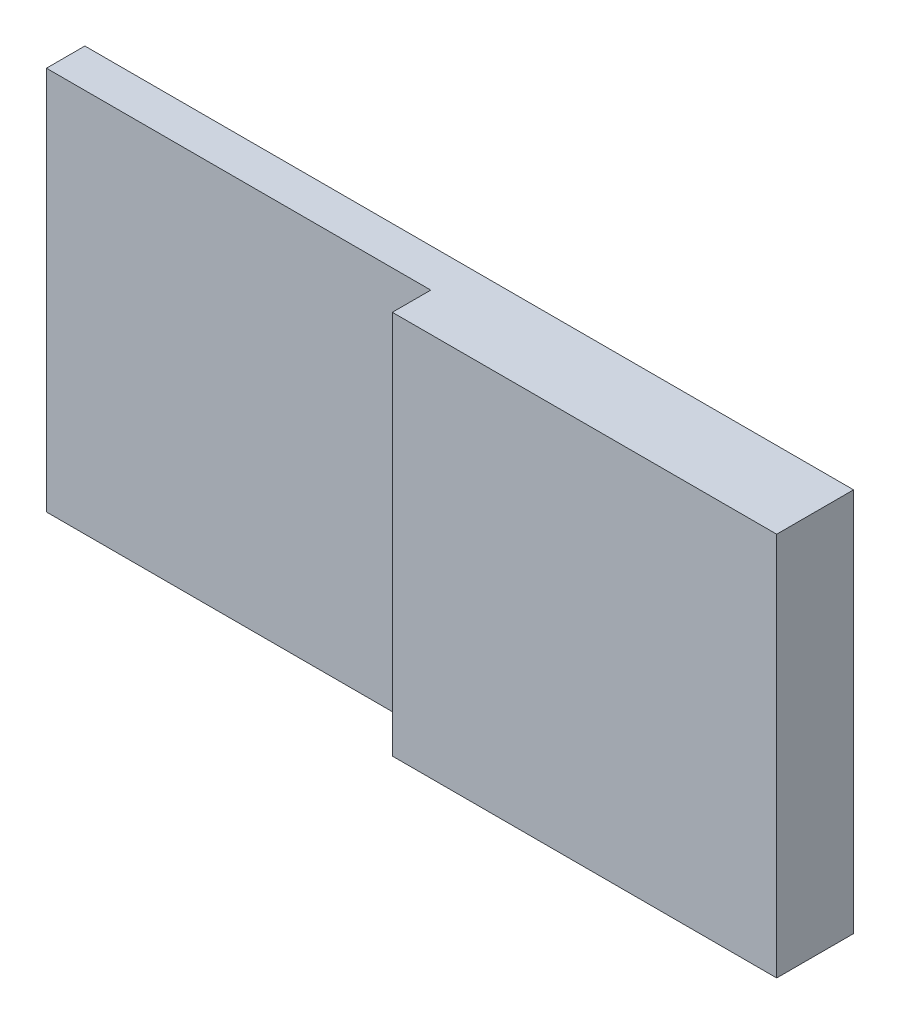
ISO-10303-21;
HEADER;
FILE_DESCRIPTION(('STEP AP214'),'2;1');
FILE_NAME('part.step','',(''),(''),'','','');
FILE_SCHEMA(('AUTOMOTIVE_DESIGN { 1 0 10303 214 1 1 1 1 }'));
ENDSEC;
DATA;
#1=APPLICATION_CONTEXT('core data for automotive mechanical design processes');
#2=APPLICATION_PROTOCOL_DEFINITION('international standard','automotive_design',2000,#1);
#3=PRODUCT_CONTEXT('',#1,'mechanical');
#4=PRODUCT('Part','Part','',(#3));
#5=PRODUCT_RELATED_PRODUCT_CATEGORY('part','',(#4));
#6=PRODUCT_DEFINITION_FORMATION('','',#4);
#7=PRODUCT_DEFINITION_CONTEXT('part definition',#1,'design');
#8=PRODUCT_DEFINITION('design','',#6,#7);
#9=PRODUCT_DEFINITION_SHAPE('','',#8);
#10=(LENGTH_UNIT() NAMED_UNIT(*) SI_UNIT(.MILLI.,.METRE.));
#11=(NAMED_UNIT(*) PLANE_ANGLE_UNIT() SI_UNIT($,.RADIAN.));
#12=(NAMED_UNIT(*) SI_UNIT($,.STERADIAN.) SOLID_ANGLE_UNIT());
#13=UNCERTAINTY_MEASURE_WITH_UNIT(LENGTH_MEASURE(1.E-05),#10,'distance_accuracy_value','');
#14=(GEOMETRIC_REPRESENTATION_CONTEXT(3) GLOBAL_UNCERTAINTY_ASSIGNED_CONTEXT((#13)) GLOBAL_UNIT_ASSIGNED_CONTEXT((#10,
#11,#12)) REPRESENTATION_CONTEXT('',''));
#15=CARTESIAN_POINT('',(0.,0.,0.));
#16=DIRECTION('',(0.,0.,1.));
#17=DIRECTION('',(1.,0.,0.));
#18=AXIS2_PLACEMENT_3D('',#15,#16,#17);
#19=CARTESIAN_POINT('',(0.,0.,10.));
#20=DIRECTION('',(0.,0.,-1.));
#21=DIRECTION('',(-1.,0.,0.));
#22=AXIS2_PLACEMENT_3D('',#19,#20,#21);
#23=PLANE('',#22);
#24=DIRECTION('',(0.,-1.,0.));
#25=VECTOR('',#24,1.);
#26=CARTESIAN_POINT('',(0.,50.,10.));
#27=LINE('',#26,#25);
#28=CARTESIAN_POINT('',(0.,50.,10.));
#29=VERTEX_POINT('',#28);
#30=CARTESIAN_POINT('',(0.,-50.,10.));
#31=VERTEX_POINT('',#30);
#32=EDGE_CURVE('E55',#29,#31,#27,.T.);
#33=ORIENTED_EDGE('',*,*,#32,.F.);
#34=DIRECTION('',(-1.,0.,0.));
#35=VECTOR('',#34,1.);
#36=CARTESIAN_POINT('',(-100.,50.,10.));
#37=LINE('',#36,#35);
#38=CARTESIAN_POINT('',(-100.,50.,10.));
#39=VERTEX_POINT('',#38);
#40=EDGE_CURVE('E94',#29,#39,#37,.T.);
#41=ORIENTED_EDGE('',*,*,#40,.T.);
#42=DIRECTION('',(0.,-1.,0.));
#43=VECTOR('',#42,1.);
#44=CARTESIAN_POINT('',(-100.,-50.,10.));
#45=LINE('',#44,#43);
#46=CARTESIAN_POINT('',(-100.,-50.,10.));
#47=VERTEX_POINT('',#46);
#48=EDGE_CURVE('E61',#39,#47,#45,.T.);
#49=ORIENTED_EDGE('',*,*,#48,.T.);
#50=DIRECTION('',(1.,0.,0.));
#51=VECTOR('',#50,1.);
#52=CARTESIAN_POINT('',(-100.,-50.,10.));
#53=LINE('',#52,#51);
#54=EDGE_CURVE('E105',#47,#31,#53,.T.);
#55=ORIENTED_EDGE('',*,*,#54,.T.);
#56=EDGE_LOOP('',(#33,#41,#49,#55));
#57=FACE_BOUND('',#56,.T.);
#58=ADVANCED_FACE('F39',(#57),#23,.F.);
#59=CARTESIAN_POINT('',(100.,-50.,10.));
#60=DIRECTION('',(-1.,0.,0.));
#61=DIRECTION('',(0.,0.,1.));
#62=AXIS2_PLACEMENT_3D('',#59,#60,#61);
#63=PLANE('',#62);
#64=DIRECTION('',(0.,1.,0.));
#65=VECTOR('',#64,1.);
#66=CARTESIAN_POINT('',(100.,-50.,0.));
#67=LINE('',#66,#65);
#68=CARTESIAN_POINT('',(100.,-50.,0.));
#69=VERTEX_POINT('',#68);
#70=CARTESIAN_POINT('',(100.,50.,0.));
#71=VERTEX_POINT('',#70);
#72=EDGE_CURVE('E101',#69,#71,#67,.T.);
#73=ORIENTED_EDGE('',*,*,#72,.T.);
#74=DIRECTION('',(0.,0.,-1.));
#75=VECTOR('',#74,1.);
#76=CARTESIAN_POINT('',(100.,50.,10.));
#77=LINE('',#76,#75);
#78=CARTESIAN_POINT('',(100.,50.,20.));
#79=VERTEX_POINT('',#78);
#80=EDGE_CURVE('E11',#79,#71,#77,.T.);
#81=ORIENTED_EDGE('',*,*,#80,.F.);
#82=DIRECTION('',(0.,1.,0.));
#83=VECTOR('',#82,1.);
#84=CARTESIAN_POINT('',(100.,50.,20.));
#85=LINE('',#84,#83);
#86=CARTESIAN_POINT('',(100.,-50.,20.));
#87=VERTEX_POINT('',#86);
#88=EDGE_CURVE('E103',#87,#79,#85,.T.);
#89=ORIENTED_EDGE('',*,*,#88,.F.);
#90=DIRECTION('',(0.,0.,-1.));
#91=VECTOR('',#90,1.);
#92=CARTESIAN_POINT('',(100.,-50.,10.));
#93=LINE('',#92,#91);
#94=EDGE_CURVE('E86',#87,#69,#93,.T.);
#95=ORIENTED_EDGE('',*,*,#94,.T.);
#96=EDGE_LOOP('',(#73,#81,#89,#95));
#97=FACE_BOUND('',#96,.T.);
#98=ADVANCED_FACE('F41',(#97),#63,.F.);
#99=CARTESIAN_POINT('',(-100.,50.,10.));
#100=DIRECTION('',(0.,-1.,0.));
#101=DIRECTION('',(0.,0.,-1.));
#102=AXIS2_PLACEMENT_3D('',#99,#100,#101);
#103=PLANE('',#102);
#104=DIRECTION('',(-1.,0.,0.));
#105=VECTOR('',#104,1.);
#106=CARTESIAN_POINT('',(-100.,50.,0.));
#107=LINE('',#106,#105);
#108=CARTESIAN_POINT('',(-100.,50.,0.));
#109=VERTEX_POINT('',#108);
#110=EDGE_CURVE('E108',#71,#109,#107,.T.);
#111=ORIENTED_EDGE('',*,*,#110,.T.);
#112=DIRECTION('',(0.,0.,-1.));
#113=VECTOR('',#112,1.);
#114=CARTESIAN_POINT('',(-100.,50.,10.));
#115=LINE('',#114,#113);
#116=EDGE_CURVE('E48',#39,#109,#115,.T.);
#117=ORIENTED_EDGE('',*,*,#116,.F.);
#118=ORIENTED_EDGE('',*,*,#40,.F.);
#119=DIRECTION('',(0.,0.,-1.));
#120=VECTOR('',#119,1.);
#121=CARTESIAN_POINT('',(0.,50.,20.));
#122=LINE('',#121,#120);
#123=CARTESIAN_POINT('',(0.,50.,20.));
#124=VERTEX_POINT('',#123);
#125=EDGE_CURVE('E116',#124,#29,#122,.T.);
#126=ORIENTED_EDGE('',*,*,#125,.F.);
#127=DIRECTION('',(-1.,0.,0.));
#128=VECTOR('',#127,1.);
#129=CARTESIAN_POINT('',(0.,50.,20.));
#130=LINE('',#129,#128);
#131=EDGE_CURVE('E136',#79,#124,#130,.T.);
#132=ORIENTED_EDGE('',*,*,#131,.F.);
#133=ORIENTED_EDGE('',*,*,#80,.T.);
#134=EDGE_LOOP('',(#111,#117,#118,#126,#132,#133));
#135=FACE_BOUND('',#134,.T.);
#136=ADVANCED_FACE('F130',(#135),#103,.F.);
#137=CARTESIAN_POINT('',(-100.,-50.,10.));
#138=DIRECTION('',(1.,0.,0.));
#139=DIRECTION('',(0.,0.,-1.));
#140=AXIS2_PLACEMENT_3D('',#137,#138,#139);
#141=PLANE('',#140);
#142=DIRECTION('',(0.,-1.,0.));
#143=VECTOR('',#142,1.);
#144=CARTESIAN_POINT('',(-100.,-50.,0.));
#145=LINE('',#144,#143);
#146=CARTESIAN_POINT('',(-100.,-50.,0.));
#147=VERTEX_POINT('',#146);
#148=EDGE_CURVE('E95',#109,#147,#145,.T.);
#149=ORIENTED_EDGE('',*,*,#148,.T.);
#150=DIRECTION('',(0.,0.,-1.));
#151=VECTOR('',#150,1.);
#152=CARTESIAN_POINT('',(-100.,-50.,10.));
#153=LINE('',#152,#151);
#154=EDGE_CURVE('E89',#47,#147,#153,.T.);
#155=ORIENTED_EDGE('',*,*,#154,.F.);
#156=ORIENTED_EDGE('',*,*,#48,.F.);
#157=ORIENTED_EDGE('',*,*,#116,.T.);
#158=EDGE_LOOP('',(#149,#155,#156,#157));
#159=FACE_BOUND('',#158,.T.);
#160=ADVANCED_FACE('F128',(#159),#141,.F.);
#161=CARTESIAN_POINT('',(-100.,-50.,10.));
#162=DIRECTION('',(0.,1.,0.));
#163=DIRECTION('',(0.,0.,1.));
#164=AXIS2_PLACEMENT_3D('',#161,#162,#163);
#165=PLANE('',#164);
#166=DIRECTION('',(1.,0.,0.));
#167=VECTOR('',#166,1.);
#168=CARTESIAN_POINT('',(-100.,-50.,0.));
#169=LINE('',#168,#167);
#170=EDGE_CURVE('E81',#147,#69,#169,.T.);
#171=ORIENTED_EDGE('',*,*,#170,.T.);
#172=ORIENTED_EDGE('',*,*,#94,.F.);
#173=DIRECTION('',(1.,0.,0.));
#174=VECTOR('',#173,1.);
#175=CARTESIAN_POINT('',(0.,-50.,20.));
#176=LINE('',#175,#174);
#177=CARTESIAN_POINT('',(0.,-50.,20.));
#178=VERTEX_POINT('',#177);
#179=EDGE_CURVE('E141',#178,#87,#176,.T.);
#180=ORIENTED_EDGE('',*,*,#179,.F.);
#181=DIRECTION('',(0.,0.,-1.));
#182=VECTOR('',#181,1.);
#183=CARTESIAN_POINT('',(0.,-50.,20.));
#184=LINE('',#183,#182);
#185=EDGE_CURVE('E110',#178,#31,#184,.T.);
#186=ORIENTED_EDGE('',*,*,#185,.T.);
#187=ORIENTED_EDGE('',*,*,#54,.F.);
#188=ORIENTED_EDGE('',*,*,#154,.T.);
#189=EDGE_LOOP('',(#171,#172,#180,#186,#187,#188));
#190=FACE_BOUND('',#189,.T.);
#191=ADVANCED_FACE('F83',(#190),#165,.F.);
#192=CARTESIAN_POINT('',(0.,0.,0.));
#193=DIRECTION('',(0.,0.,-1.));
#194=DIRECTION('',(-1.,0.,0.));
#195=AXIS2_PLACEMENT_3D('',#192,#193,#194);
#196=PLANE('',#195);
#197=ORIENTED_EDGE('',*,*,#72,.F.);
#198=ORIENTED_EDGE('',*,*,#170,.F.);
#199=ORIENTED_EDGE('',*,*,#148,.F.);
#200=ORIENTED_EDGE('',*,*,#110,.F.);
#201=EDGE_LOOP('',(#197,#198,#199,#200));
#202=FACE_BOUND('',#201,.T.);
#203=ADVANCED_FACE('F107',(#202),#196,.T.);
#204=CARTESIAN_POINT('',(0.,50.,20.));
#205=DIRECTION('',(1.,0.,0.));
#206=DIRECTION('',(0.,0.,-1.));
#207=AXIS2_PLACEMENT_3D('',#204,#205,#206);
#208=PLANE('',#207);
#209=ORIENTED_EDGE('',*,*,#32,.T.);
#210=ORIENTED_EDGE('',*,*,#185,.F.);
#211=DIRECTION('',(0.,-1.,0.));
#212=VECTOR('',#211,1.);
#213=CARTESIAN_POINT('',(0.,50.,20.));
#214=LINE('',#213,#212);
#215=EDGE_CURVE('E147',#124,#178,#214,.T.);
#216=ORIENTED_EDGE('',*,*,#215,.F.);
#217=ORIENTED_EDGE('',*,*,#125,.T.);
#218=EDGE_LOOP('',(#209,#210,#216,#217));
#219=FACE_BOUND('',#218,.T.);
#220=ADVANCED_FACE('F163',(#219),#208,.F.);
#221=CARTESIAN_POINT('',(0.,0.,20.));
#222=DIRECTION('',(0.,0.,1.));
#223=DIRECTION('',(1.,0.,0.));
#224=AXIS2_PLACEMENT_3D('',#221,#222,#223);
#225=PLANE('',#224);
#226=ORIENTED_EDGE('',*,*,#215,.T.);
#227=ORIENTED_EDGE('',*,*,#179,.T.);
#228=ORIENTED_EDGE('',*,*,#88,.T.);
#229=ORIENTED_EDGE('',*,*,#131,.T.);
#230=EDGE_LOOP('',(#226,#227,#228,#229));
#231=FACE_BOUND('',#230,.T.);
#232=ADVANCED_FACE('F140',(#231),#225,.T.);
#233=CLOSED_SHELL('',(#58,#98,#136,#160,#191,#203,#220,#232));
#234=MANIFOLD_SOLID_BREP('B2',#233);
#235=ADVANCED_BREP_SHAPE_REPRESENTATION('',(#18,#234),#14);
#236=SHAPE_DEFINITION_REPRESENTATION(#9,#235);
ENDSEC;
END-ISO-10303-21;
